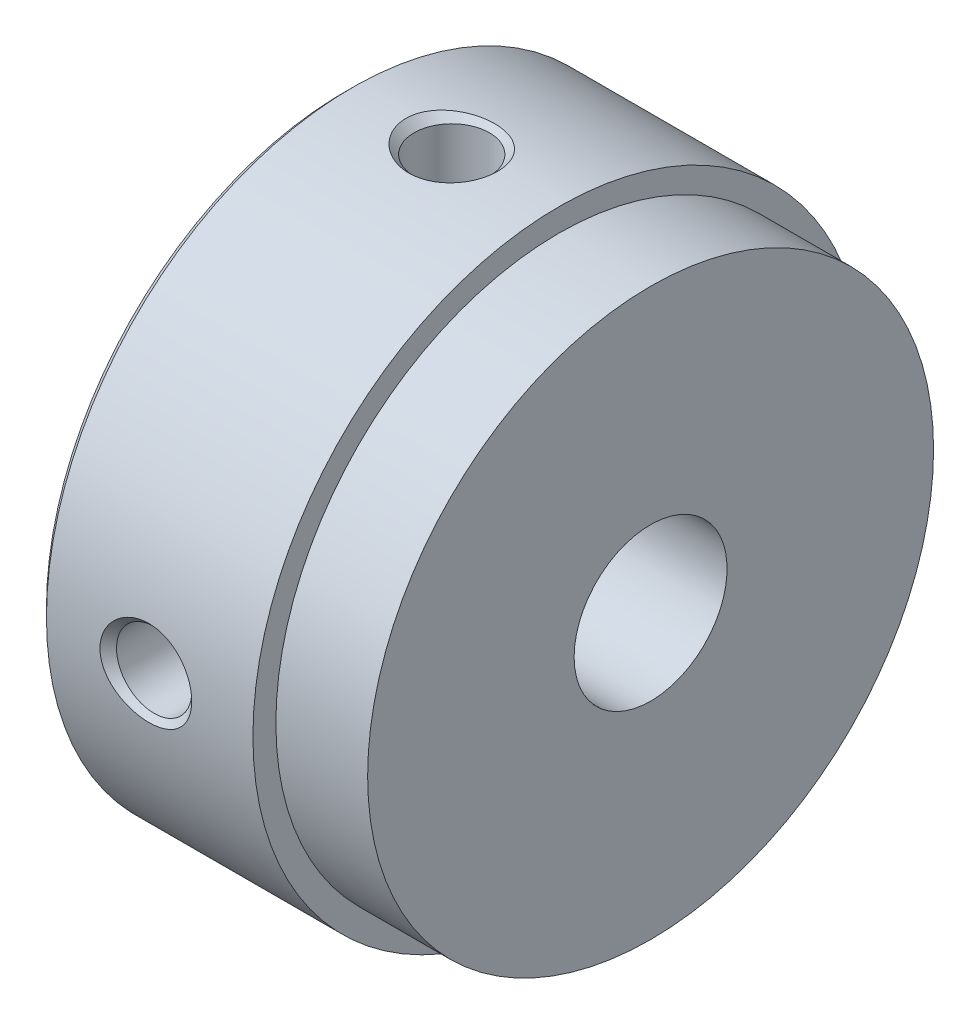
ISO-10303-21;
HEADER;
FILE_DESCRIPTION(('STEP AP214'),'2;1');
FILE_NAME('part.step','',(''),(''),'','','');
FILE_SCHEMA(('AUTOMOTIVE_DESIGN { 1 0 10303 214 1 1 1 1 }'));
ENDSEC;
DATA;
#1=APPLICATION_CONTEXT('core data for automotive mechanical design processes');
#2=APPLICATION_PROTOCOL_DEFINITION('international standard','automotive_design',2000,#1);
#3=PRODUCT_CONTEXT('',#1,'mechanical');
#4=PRODUCT('Part','Part','',(#3));
#5=PRODUCT_RELATED_PRODUCT_CATEGORY('part','',(#4));
#6=PRODUCT_DEFINITION_FORMATION('','',#4);
#7=PRODUCT_DEFINITION_CONTEXT('part definition',#1,'design');
#8=PRODUCT_DEFINITION('design','',#6,#7);
#9=PRODUCT_DEFINITION_SHAPE('','',#8);
#10=(LENGTH_UNIT() NAMED_UNIT(*) SI_UNIT(.MILLI.,.METRE.));
#11=(NAMED_UNIT(*) PLANE_ANGLE_UNIT() SI_UNIT($,.RADIAN.));
#12=(NAMED_UNIT(*) SI_UNIT($,.STERADIAN.) SOLID_ANGLE_UNIT());
#13=UNCERTAINTY_MEASURE_WITH_UNIT(LENGTH_MEASURE(1.E-05),#10,'distance_accuracy_value','');
#14=(GEOMETRIC_REPRESENTATION_CONTEXT(3) GLOBAL_UNCERTAINTY_ASSIGNED_CONTEXT((#13)) GLOBAL_UNIT_ASSIGNED_CONTEXT((#10,
#11,#12)) REPRESENTATION_CONTEXT('',''));
#15=CARTESIAN_POINT('',(0.,0.,0.));
#16=DIRECTION('',(0.,0.,1.));
#17=DIRECTION('',(1.,0.,0.));
#18=AXIS2_PLACEMENT_3D('',#15,#16,#17);
#19=CARTESIAN_POINT('',(10.,0.,0.));
#20=DIRECTION('',(-1.,0.,0.));
#21=DIRECTION('',(0.,0.,1.));
#22=AXIS2_PLACEMENT_3D('',#19,#20,#21);
#23=CYLINDRICAL_SURFACE('',#22,2.5);
#24=CARTESIAN_POINT('',(3.5,2.17677048629386,1.2295));
#25=CARTESIAN_POINT('',(3.43577157965054,2.17677578477281,1.22949567603831));
#26=CARTESIAN_POINT('',(3.37145840161485,2.17965613127623,1.22443373564332));
#27=CARTESIAN_POINT('',(3.24479296186269,2.19076511977838,1.20443802978489));
#28=CARTESIAN_POINT('',(3.18244526348724,2.19900536665854,1.1894828429574));
#29=CARTESIAN_POINT('',(3.06178049434796,2.21964982106772,1.15049288244603));
#30=CARTESIAN_POINT('',(3.00344436421692,2.23203242174292,1.12650514337545));
#31=CARTESIAN_POINT('',(2.89163886446666,2.25953301614397,1.07027430140568));
#32=CARTESIAN_POINT('',(2.83816961993367,2.27465108014549,1.03803098640703));
#33=CARTESIAN_POINT('',(2.73290921309165,2.3073920945376,0.96319105589198));
#34=CARTESIAN_POINT('',(2.68159095423238,2.32511864855142,0.919974340812396));
#35=CARTESIAN_POINT('',(2.58656498240778,2.36024183474851,0.825705223797949));
#36=CARTESIAN_POINT('',(2.54286096186909,2.37763830323748,0.774649042667674));
#37=CARTESIAN_POINT('',(2.46153942300686,2.41148805301282,0.662111759830687));
#38=CARTESIAN_POINT('',(2.42449857287542,2.42780750797796,0.600169916725053));
#39=CARTESIAN_POINT('',(2.36157797349174,2.45632763167845,0.46998145208829));
#40=CARTESIAN_POINT('',(2.33569140498105,2.46853081593453,0.401738713738438));
#41=CARTESIAN_POINT('',(2.29767038465962,2.48669812919369,0.265891555059109));
#42=CARTESIAN_POINT('',(2.28470809767051,2.49303563135054,0.198569883084163));
#43=CARTESIAN_POINT('',(2.2701826485084,2.50014754841693,0.062431543623865));
#44=CARTESIAN_POINT('',(2.26861284478198,2.50092520458377,-0.00638422935997371));
#45=CARTESIAN_POINT('',(2.27658529460569,2.4970114095747,-0.137355324561393));
#46=CARTESIAN_POINT('',(2.28520306373557,2.49277493337475,-0.199583587425359));
#47=CARTESIAN_POINT('',(2.31165896649324,2.47999000195402,-0.32157751857906));
#48=CARTESIAN_POINT('',(2.32949778835595,2.47144122487569,-0.381343002693965));
#49=CARTESIAN_POINT('',(2.37401940944104,2.45066728865061,-0.497775066556948));
#50=CARTESIAN_POINT('',(2.4008239398625,2.43839175419107,-0.554385738103421));
#51=CARTESIAN_POINT('',(2.46235522020839,2.41128063708328,-0.662445269391631));
#52=CARTESIAN_POINT('',(2.4970848338226,2.39644412951319,-0.713892253561072));
#53=CARTESIAN_POINT('',(2.57716491658394,2.36399939359176,-0.815224939173351));
#54=CARTESIAN_POINT('',(2.62319951481388,2.34626173437661,-0.864529040870136));
#55=CARTESIAN_POINT('',(2.7227439931001,2.3109071357489,-0.955025334965638));
#56=CARTESIAN_POINT('',(2.77625925277105,2.29329029286998,-0.996211637731079));
#57=CARTESIAN_POINT('',(2.89318262553734,2.25903811194194,-1.07171295926343));
#58=CARTESIAN_POINT('',(2.9569913931846,2.2425248517817,-1.10546831979465));
#59=CARTESIAN_POINT('',(3.09038839394562,2.21402136988789,-1.16151111416587));
#60=CARTESIAN_POINT('',(3.15997067798962,2.20202656123413,-1.1838101863077));
#61=CARTESIAN_POINT('',(3.29719196264242,2.18522310291627,-1.21453126486853));
#62=CARTESIAN_POINT('',(3.3645561040228,2.17992506876643,-1.22390361582539));
#63=CARTESIAN_POINT('',(3.50008742973265,2.17571958580807,-1.23136818919575));
#64=CARTESIAN_POINT('',(3.56825405861162,2.17680794945379,-1.22946780310708));
#65=CARTESIAN_POINT('',(3.6958961500224,2.18473415235663,-1.21531307007751));
#66=CARTESIAN_POINT('',(3.75553746114942,2.19096146722198,-1.20415754159092));
#67=CARTESIAN_POINT('',(3.8719956843156,2.20757429471399,-1.17342172153825));
#68=CARTESIAN_POINT('',(3.92881171175825,2.21796110057637,-1.15383880965598));
#69=CARTESIAN_POINT('',(4.04100028888366,2.24229086091557,-1.10584115883859));
#70=CARTESIAN_POINT('',(4.09618336454172,2.25637652545819,-1.07705860264962));
#71=CARTESIAN_POINT('',(4.20125178639368,2.28638221414764,-1.01180305697916));
#72=CARTESIAN_POINT('',(4.25113440655533,2.302303173498,-0.975326138787441));
#73=CARTESIAN_POINT('',(4.35050540629355,2.33650488623315,-0.890547969281477));
#74=CARTESIAN_POINT('',(4.39921394934577,2.35483785989399,-0.841349600017137));
#75=CARTESIAN_POINT('',(4.48791770975632,2.39011576473906,-0.735170333697024));
#76=CARTESIAN_POINT('',(4.52791028289974,2.40706027372645,-0.678187083402165));
#77=CARTESIAN_POINT('',(4.5988105256981,2.43817034984067,-0.556212373445873));
#78=CARTESIAN_POINT('',(4.62948583191873,2.45226230312163,-0.491065760619433));
#79=CARTESIAN_POINT('',(4.67914182473642,2.47552428578934,-0.355645146989717));
#80=CARTESIAN_POINT('',(4.69813244821317,2.48469849646164,-0.285375559910457));
#81=CARTESIAN_POINT('',(4.72229311354851,2.49644369158283,-0.148517610673093));
#82=CARTESIAN_POINT('',(4.72855118181735,2.49953370230837,-0.0821653994041285));
#83=CARTESIAN_POINT('',(4.73024751400786,2.50036729947071,0.0507015142390307));
#84=CARTESIAN_POINT('',(4.72568931889951,2.49811263561851,0.117216156315824));
#85=CARTESIAN_POINT('',(4.70661557835031,2.48881280949547,0.24415665625837));
#86=CARTESIAN_POINT('',(4.69273920156548,2.48207539270445,0.304703445078503));
#87=CARTESIAN_POINT('',(4.65626667938988,2.4647566874324,0.422518922449894));
#88=CARTESIAN_POINT('',(4.63366924376144,2.45417483019894,0.479787124510088));
#89=CARTESIAN_POINT('',(4.57935823963063,2.42955413606576,0.592219221508784));
#90=CARTESIAN_POINT('',(4.54728997682307,2.41538462396106,0.64718231755628));
#91=CARTESIAN_POINT('',(4.47539777480865,2.38509292957185,0.751179317764917));
#92=CARTESIAN_POINT('',(4.43557026410778,2.36896984937902,0.800210474610425));
#93=CARTESIAN_POINT('',(4.34482120586829,2.3345498637693,0.895939325934751));
#94=CARTESIAN_POINT('',(4.29319956782694,2.31619343676598,0.941953864582264));
#95=CARTESIAN_POINT('',(4.18265676989454,2.28070453217253,1.02490379971784));
#96=CARTESIAN_POINT('',(4.1237295674233,2.26357308650405,1.06183160401926));
#97=CARTESIAN_POINT('',(3.99811540019695,2.23218633257751,1.12635219651385));
#98=CARTESIAN_POINT('',(3.93126314651844,2.21802012200815,1.15366913997149));
#99=CARTESIAN_POINT('',(3.79303089853435,2.1953595965793,1.1962413576225));
#100=CARTESIAN_POINT('',(3.72166695611406,2.18684629005014,1.21153705090943));
#101=CARTESIAN_POINT('',(3.62464277706254,2.18019396355339,1.2234218188025));
#102=CARTESIAN_POINT('',(3.59979101049453,2.17891433517125,1.22569784953065));
#103=CARTESIAN_POINT('',(3.54996377755157,2.17720153873151,1.2287378296906));
#104=CARTESIAN_POINT('',(3.52498830335473,2.17676842490112,1.22950168225321));
#105=CARTESIAN_POINT('',(3.5,2.17677048629386,1.2295));
#106=B_SPLINE_CURVE_WITH_KNOTS('',3,(#24,#25,#26,#27,#28,#29,#30,#31,#32,#33,#34,#35,#36,#37,
#38,#39,#40,#41,#42,#43,#44,#45,#46,#47,#48,#49,#50,#51,#52,#53,#54,#55,#56,#57,#58,#59,#60,#61,
#62,#63,#64,#65,#66,#67,#68,#69,#70,#71,#72,#73,#74,#75,#76,#77,#78,#79,#80,#81,#82,#83,#84,#85,
#86,#87,#88,#89,#90,#91,#92,#93,#94,#95,#96,#97,#98,#99,#100,#101,#102,#103,#104,#105),
.UNSPECIFIED.,.T.,.F.,(4,2,2,2,2,2,2,2,2,2,2,2,2,2,2,2,2,2,2,2,2,2,2,2,2,2,2,2,2,2,2,2,2,2,2,2,
2,2,2,2,4),(0.,0.192580175732902,0.385578706777902,0.577585843527017,0.769597913753682,
0.97690428705383,1.18431091276645,1.40513537879893,1.6258246498356,1.83123896452729,
2.03653351781269,2.22454267582913,2.41256586837708,2.60325321150315,2.79400956797831,
3.00235895872482,3.21085895935151,3.43185325712993,3.65262260338025,3.85609543140499,
4.0594348576977,4.24159951831491,4.4238208601409,4.61450199283324,4.80528072324143,
5.01917124170217,5.23312655933436,5.45204697150888,5.67078095128508,5.86987095279382,
6.06889578628379,6.25549992963017,6.44213169072983,6.63690550028795,6.83176917474926,
7.04546008301269,7.25932893353865,7.47891327110501,7.6977561026392,7.77267532975101,
7.84759935598639),.UNSPECIFIED.);
#107=CARTESIAN_POINT('',(3.5,2.17677048629386,1.2295));
#108=VERTEX_POINT('',#107);
#109=EDGE_CURVE('E54',#108,#108,#106,.T.);
#110=ORIENTED_EDGE('',*,*,#109,.F.);
#111=EDGE_LOOP('',(#110));
#112=FACE_BOUND('',#111,.T.);
#113=CARTESIAN_POINT('',(10.,0.,0.));
#114=DIRECTION('',(-1.,0.,0.));
#115=DIRECTION('',(0.,0.,1.));
#116=AXIS2_PLACEMENT_3D('',#113,#114,#115);
#117=CIRCLE('',#116,2.5);
#118=CARTESIAN_POINT('',(10.,0.,2.5));
#119=VERTEX_POINT('',#118);
#120=EDGE_CURVE('E85',#119,#119,#117,.T.);
#121=ORIENTED_EDGE('',*,*,#120,.F.);
#122=EDGE_LOOP('',(#121));
#123=FACE_BOUND('',#122,.T.);
#124=CARTESIAN_POINT('',(0.,0.,0.));
#125=DIRECTION('',(-1.,0.,0.));
#126=DIRECTION('',(0.,0.,1.));
#127=AXIS2_PLACEMENT_3D('',#124,#125,#126);
#128=CIRCLE('',#127,2.5);
#129=CARTESIAN_POINT('',(0.,0.,2.5));
#130=VERTEX_POINT('',#129);
#131=EDGE_CURVE('E82',#130,#130,#128,.T.);
#132=ORIENTED_EDGE('',*,*,#131,.T.);
#133=EDGE_LOOP('',(#132));
#134=FACE_BOUND('',#133,.T.);
#135=CARTESIAN_POINT('',(4.7295,0.,2.5));
#136=CARTESIAN_POINT('',(4.72949603187039,-0.0647636833712208,2.49999658207312));
#137=CARTESIAN_POINT('',(4.72435277737242,-0.129608343857132,2.4974562169426));
#138=CARTESIAN_POINT('',(4.70400345815839,-0.257389133636325,2.4875445875616));
#139=CARTESIAN_POINT('',(4.68877746472509,-0.320321224534262,2.480163756321));
#140=CARTESIAN_POINT('',(4.64899793940587,-0.442231870711784,2.46134540862177));
#141=CARTESIAN_POINT('',(4.62448025447225,-0.501224607803293,2.44992349360497));
#142=CARTESIAN_POINT('',(4.56699482434259,-0.614175758927704,2.42407712407513));
#143=CARTESIAN_POINT('',(4.53402792715237,-0.668134677439307,2.40965297090923));
#144=CARTESIAN_POINT('',(4.45836072778912,-0.773073934844122,2.37813646129837));
#145=CARTESIAN_POINT('',(4.41520039478979,-0.823689877699854,2.36093680580909));
#146=CARTESIAN_POINT('',(4.32135946608241,-0.917298593169716,2.32616882044197));
#147=CARTESIAN_POINT('',(4.27067338928058,-0.960285759133896,2.30860022993867));
#148=CARTESIAN_POINT('',(4.1586919295908,-1.04061901097977,2.27358157758193));
#149=CARTESIAN_POINT('',(4.09688780204427,-1.07730753751897,2.25623756310688));
#150=CARTESIAN_POINT('',(3.96703856698149,-1.13961413308907,2.2254204220195));
#151=CARTESIAN_POINT('',(3.89899784818211,-1.16523991560704,2.21194460051743));
#152=CARTESIAN_POINT('',(3.76271192748435,-1.20305906421733,2.19159498373794));
#153=CARTESIAN_POINT('',(3.69471550443621,-1.21595556833272,2.18437866068211));
#154=CARTESIAN_POINT('',(3.55717252144128,-1.23010932063801,2.17644311330003));
#155=CARTESIAN_POINT('',(3.48762746619314,-1.23137741169964,2.17571783643639));
#156=CARTESIAN_POINT('',(3.35753517987713,-1.22275526426916,2.18056907697431));
#157=CARTESIAN_POINT('',(3.29687121553702,-1.21412879042285,2.18543198877257));
#158=CARTESIAN_POINT('',(3.17799658293549,-1.18814454369174,2.19966582501935));
#159=CARTESIAN_POINT('',(3.11978666047776,-1.17078413693011,2.2090381093142));
#160=CARTESIAN_POINT('',(3.00581610209196,-1.12750056916178,2.23144469225344));
#161=CARTESIAN_POINT('',(2.95014425585387,-1.10138714098109,2.24455930249789));
#162=CARTESIAN_POINT('',(2.84370943962882,-1.0414829193328,2.27297408460156));
#163=CARTESIAN_POINT('',(2.79294868180232,-1.00768868885233,2.28827523375383));
#164=CARTESIAN_POINT('',(2.6912494179781,-0.928565514752044,2.32159930545813));
#165=CARTESIAN_POINT('',(2.64104649743907,-0.882331859602548,2.33972639700315));
#166=CARTESIAN_POINT('',(2.54880628745666,-0.782014276592369,2.37513860012382));
#167=CARTESIAN_POINT('',(2.50677266042554,-0.727926846668179,2.39242333146745));
#168=CARTESIAN_POINT('',(2.43035123216446,-0.610442207437641,2.42512527090917));
#169=CARTESIAN_POINT('',(2.39637639476599,-0.546742031024941,2.44042828644209));
#170=CARTESIAN_POINT('',(2.3398986515071,-0.413586219748224,2.46648211348183));
#171=CARTESIAN_POINT('',(2.31738691713653,-0.344135062180641,2.47723642716678));
#172=CARTESIAN_POINT('',(2.28627541981136,-0.207482175212804,2.49224560157084));
#173=CARTESIAN_POINT('',(2.27669654477147,-0.140553860220579,2.49695633199743));
#174=CARTESIAN_POINT('',(2.26866762009355,-0.00588357252022877,2.50089881647761));
#175=CARTESIAN_POINT('',(2.27021255058848,0.0618580194015698,2.5001330419281));
#176=CARTESIAN_POINT('',(2.28380479154928,0.190875285752288,2.49347781447482));
#177=CARTESIAN_POINT('',(2.29506177864625,0.252256917390151,2.4879739946304));
#178=CARTESIAN_POINT('',(2.32653399427042,0.372142260170015,2.47288537323486));
#179=CARTESIAN_POINT('',(2.34675022509037,0.43064564850202,2.46330011508786));
#180=CARTESIAN_POINT('',(2.39612135977761,0.545087748749939,2.44057053305261));
#181=CARTESIAN_POINT('',(2.42552035132528,0.60090144634679,2.42733033521226));
#182=CARTESIAN_POINT('',(2.49215030489769,0.70699209196955,2.39858040750409));
#183=CARTESIAN_POINT('',(2.52938464615396,0.757266636768527,2.38306969929134));
#184=CARTESIAN_POINT('',(2.61474702044672,0.855950394229441,2.3495356461416));
#185=CARTESIAN_POINT('',(2.6635766212127,0.90372049778804,2.33141390280801));
#186=CARTESIAN_POINT('',(2.76862866585851,0.990666142300591,2.29582061390858));
#187=CARTESIAN_POINT('',(2.82485577771225,1.02983621446433,2.27834948790175));
#188=CARTESIAN_POINT('',(2.94626993232085,1.10008347153956,2.24530448109281));
#189=CARTESIAN_POINT('',(3.01174319548736,1.13072631362942,2.22984862447142));
#190=CARTESIAN_POINT('',(3.14792519079201,1.18023102354872,2.20405215859972));
#191=CARTESIAN_POINT('',(3.21862727467823,1.19910757321479,2.19370517792266));
#192=CARTESIAN_POINT('',(3.35607459143964,1.22284423562783,2.18055487114542));
#193=CARTESIAN_POINT('',(3.42255895274951,1.22886410108423,2.17712905369796));
#194=CARTESIAN_POINT('',(3.55564336837864,1.23003928557164,2.17646648712823));
#195=CARTESIAN_POINT('',(3.62224336765845,1.22519882833838,2.1792273319235));
#196=CARTESIAN_POINT('',(3.74740381223618,1.20586587242158,2.18997479914201));
#197=CARTESIAN_POINT('',(3.80615071913222,1.19227490767087,2.1974721959865));
#198=CARTESIAN_POINT('',(3.92047572080313,1.15691538222124,2.21629093548129));
#199=CARTESIAN_POINT('',(3.97605281397363,1.13514425304547,2.2276134790706));
#200=CARTESIAN_POINT('',(4.0865897937528,1.08239667891937,2.25373848300762));
#201=CARTESIAN_POINT('',(4.1412568079154,1.05089962658471,2.2687237643353));
#202=CARTESIAN_POINT('',(4.24488254616971,0.980183506835305,2.30016026838696));
#203=CARTESIAN_POINT('',(4.29383833909271,0.940960501751723,2.31661223628339));
#204=CARTESIAN_POINT('',(4.39055781573973,0.850559240008486,2.35141566438837));
#205=CARTESIAN_POINT('',(4.43752311639407,0.798521652503527,2.36976588178285));
#206=CARTESIAN_POINT('',(4.52222009542335,0.686768737221503,2.40453118293945));
#207=CARTESIAN_POINT('',(4.55994697855034,0.627049446642063,2.4209452594565));
#208=CARTESIAN_POINT('',(4.62501067738729,0.50106451322698,2.45012843535767));
#209=CARTESIAN_POINT('',(4.65230957909198,0.434776065540331,2.46288419274826));
#210=CARTESIAN_POINT('',(4.69502432618686,0.297825247199865,2.48315417216204));
#211=CARTESIAN_POINT('',(4.71047436981232,0.227176104998331,2.49068347279795));
#212=CARTESIAN_POINT('',(4.72290052895504,0.129864453339929,2.49676008502846));
#213=CARTESIAN_POINT('',(4.72537205515824,0.103972833553971,2.49797208686553));
#214=CARTESIAN_POINT('',(4.7286726104279,0.0520585071962429,2.49959274219882));
#215=CARTESIAN_POINT('',(4.7295015952369,0.026035797111249,2.50000137404863));
#216=CARTESIAN_POINT('',(4.7295,0.,2.5));
#217=B_SPLINE_CURVE_WITH_KNOTS('',3,(#135,#136,#137,#138,#139,#140,#141,#142,#143,#144,#145,
#146,#147,#148,#149,#150,#151,#152,#153,#154,#155,#156,#157,#158,#159,#160,#161,#162,#163,#164,
#165,#166,#167,#168,#169,#170,#171,#172,#173,#174,#175,#176,#177,#178,#179,#180,#181,#182,#183,
#184,#185,#186,#187,#188,#189,#190,#191,#192,#193,#194,#195,#196,#197,#198,#199,#200,#201,#202,
#203,#204,#205,#206,#207,#208,#209,#210,#211,#212,#213,#214,#215,#216),.UNSPECIFIED.,.T.,.F.,(4,
2,2,2,2,2,2,2,2,2,2,2,2,2,2,2,2,2,2,2,2,2,2,2,2,2,2,2,2,2,2,2,2,2,2,2,2,2,2,2,4),(0.,
0.194185230212835,0.388755421246395,0.582582486592844,0.776390106084326,0.981649554544243,
1.18705923606976,1.40774992259664,1.62828648325746,1.83581501401154,2.04315001583796,
2.22669248677917,2.41029034150982,2.59817028367634,2.78613446464778,2.99705716767379,
3.20807421336801,3.42828603454291,3.64832799821964,3.85054780847288,4.05267636821687,
4.23975913225936,4.42686283099875,4.61943756985849,4.81209553324303,5.02319351166663,
5.23442534172156,5.4549956839372,5.67529024730005,5.87468740201095,6.07400702174259,
6.25550832500642,6.43706666526517,6.63083512759275,6.82470260418549,7.04107954230419,
7.25756855504453,7.47483735102818,7.69147667983704,7.7695394269358,7.84760427736816),.UNSPECIFIED.);
#218=CARTESIAN_POINT('',(4.7295,0.,2.5));
#219=VERTEX_POINT('',#218);
#220=EDGE_CURVE('E35',#219,#219,#217,.T.);
#221=ORIENTED_EDGE('',*,*,#220,.F.);
#222=EDGE_LOOP('',(#221));
#223=FACE_BOUND('',#222,.T.);
#224=ADVANCED_FACE('F31',(#112,#123,#134,#223),#23,.F.);
#225=CARTESIAN_POINT('',(10.,0.,0.));
#226=DIRECTION('',(-1.,0.,0.));
#227=DIRECTION('',(0.,0.,1.));
#228=AXIS2_PLACEMENT_3D('',#225,#226,#227);
#229=CYLINDRICAL_SURFACE('',#228,10.);
#230=CARTESIAN_POINT('',(2.47309598092249,9.94778605897726,-1.02056484066684));
#231=CARTESIAN_POINT('',(2.41933274174871,9.95263062959757,-0.973340626952615));
#232=CARTESIAN_POINT('',(2.36902661424539,9.95753953131423,-0.922181406902327));
#233=CARTESIAN_POINT('',(2.27662565081912,9.96706009525681,-0.812848771445586));
#234=CARTESIAN_POINT('',(2.2345336949472,9.97167165284989,-0.754672907391523));
#235=CARTESIAN_POINT('',(2.15522967404471,9.98069301364553,-0.624891570634612));
#236=CARTESIAN_POINT('',(2.1192566970551,9.98500805278512,-0.552514518495112));
#237=CARTESIAN_POINT('',(2.06085125917876,9.99218217713245,-0.402404602268415));
#238=CARTESIAN_POINT('',(2.03841734088679,9.99504141904358,-0.324672315646763));
#239=CARTESIAN_POINT('',(2.009120370477,9.99880546918665,-0.171424157119612));
#240=CARTESIAN_POINT('',(2.001355837066,9.99982325385633,-0.0960829045607153));
#241=CARTESIAN_POINT('',(1.99897088227158,10.000134132845,0.0547969127958121));
#242=CARTESIAN_POINT('',(2.00434653086858,9.99942774283726,0.130335411849986));
#243=CARTESIAN_POINT('',(2.02758668161371,9.99642846551868,0.276776806105327));
#244=CARTESIAN_POINT('',(2.04502016837426,9.99419035860618,0.347749982297542));
#245=CARTESIAN_POINT('',(2.09121522673089,9.98843015489408,0.485843093178218));
#246=CARTESIAN_POINT('',(2.11997771935117,9.98490795370207,0.552962714072336));
#247=CARTESIAN_POINT('',(2.18857725546589,9.97685185794294,0.68322002111652));
#248=CARTESIAN_POINT('',(2.22865759072913,9.97229622737974,0.746227853768972));
#249=CARTESIAN_POINT('',(2.31823056204534,9.96268863790012,0.865100302179756));
#250=CARTESIAN_POINT('',(2.36772558374495,9.95763655334128,0.920963101399767));
#251=CARTESIAN_POINT('',(2.47800834910569,9.94720566914986,1.02769470585994));
#252=CARTESIAN_POINT('',(2.53930814633682,9.94182616060481,1.07803411344928));
#253=CARTESIAN_POINT('',(2.66908660529599,9.93160448647937,1.16846412161937));
#254=CARTESIAN_POINT('',(2.73756740533769,9.92676248184212,1.20855165717286));
#255=CARTESIAN_POINT('',(2.88456810471373,9.91780649351088,1.28003995542236));
#256=CARTESIAN_POINT('',(2.96345152637075,9.91376066834328,1.31070282139145));
#257=CARTESIAN_POINT('',(3.12516640354918,9.90725115216845,1.35903319840312));
#258=CARTESIAN_POINT('',(3.20799872977308,9.90478781183612,1.3766978291936));
#259=CARTESIAN_POINT('',(3.37890494961808,9.9016403905718,1.39916284519963));
#260=CARTESIAN_POINT('',(3.46705425831568,9.90103371446979,1.40340383143447));
#261=CARTESIAN_POINT('',(3.64285047271134,9.90188801080786,1.39736234029168));
#262=CARTESIAN_POINT('',(3.73049731614676,9.90334923415803,1.38707810048535));
#263=CARTESIAN_POINT('',(3.9038597532638,9.90820255712822,1.35197568328223));
#264=CARTESIAN_POINT('',(3.98954060465311,9.91161711873527,1.32698833336983));
#265=CARTESIAN_POINT('',(4.15536040711243,9.91999349782495,1.26284184582618));
#266=CARTESIAN_POINT('',(4.23549926181121,9.92495534220541,1.22368246182751));
#267=CARTESIAN_POINT('',(4.38645384802164,9.93573853306013,1.13276392847506));
#268=CARTESIAN_POINT('',(4.45739996697199,9.94154459504111,1.08121996568244));
#269=CARTESIAN_POINT('',(4.58903213293499,9.95336401245668,0.966366786758813));
#270=CARTESIAN_POINT('',(4.64972084035577,9.95937731365215,0.903060630292882));
#271=CARTESIAN_POINT('',(4.75574670294296,9.97054543330341,0.769719002046592));
#272=CARTESIAN_POINT('',(4.80169676775728,9.97572806059188,0.700174131295822));
#273=CARTESIAN_POINT('',(4.88025527609634,9.98491910225308,0.553845352816649));
#274=CARTESIAN_POINT('',(4.91287096534173,9.98892815399376,0.477065404517991));
#275=CARTESIAN_POINT('',(4.96142833074595,9.99500831512589,0.324380237309349));
#276=CARTESIAN_POINT('',(4.97839616312124,9.99719757209399,0.248805586083639));
#277=CARTESIAN_POINT('',(4.99875360733173,9.9998329306013,0.0958262205922462));
#278=CARTESIAN_POINT('',(5.00214809443108,10.0002796580196,0.0184221734579494));
#279=CARTESIAN_POINT('',(4.99538862806923,9.9993991606975,-0.131830773252802));
#280=CARTESIAN_POINT('',(4.98591227648304,9.99816065127932,-0.204711796646791));
#281=CARTESIAN_POINT('',(4.95499586976722,9.99420509136334,-0.347838665390217));
#282=CARTESIAN_POINT('',(4.93355601102558,9.9914880651363,-0.418084553976739));
#283=CARTESIAN_POINT('',(4.87943045108851,9.98485483820541,-0.554399053857458));
#284=CARTESIAN_POINT('',(4.84669308128533,9.9809331371962,-0.620446792297833));
#285=CARTESIAN_POINT('',(4.77116592021425,9.97230190263064,-0.746451685964572));
#286=CARTESIAN_POINT('',(4.72837404373032,9.96759220570929,-0.806407574095214));
#287=CARTESIAN_POINT('',(4.63157002993824,9.95758460968094,-0.921984288456229));
#288=CARTESIAN_POINT('',(4.57708180288082,9.95226874409907,-0.977204344572804));
#289=CARTESIAN_POINT('',(4.46010854860542,9.94181183598034,-1.07841183514694));
#290=CARTESIAN_POINT('',(4.39762110348151,9.93667084690019,-1.12439646719241));
#291=CARTESIAN_POINT('',(4.26184306181222,9.92673099287162,-1.20911507008739));
#292=CARTESIAN_POINT('',(4.18810621633623,9.92197942690465,-1.24713995860748));
#293=CARTESIAN_POINT('',(4.03547281470895,9.91374167164144,-1.31101728935736));
#294=CARTESIAN_POINT('',(3.95657504800434,9.91025578048892,-1.33686686398295));
#295=CARTESIAN_POINT('',(3.79156849385979,9.90477190699714,-1.37692741055618));
#296=CARTESIAN_POINT('',(3.70529692466914,9.90285834789982,-1.39048165934861));
#297=CARTESIAN_POINT('',(3.53166223912944,9.90103809639314,-1.40338405437722));
#298=CARTESIAN_POINT('',(3.44429884215032,9.90113193100181,-1.40272846998529));
#299=CARTESIAN_POINT('',(3.26901103637584,9.90334036608968,-1.38705236189585));
#300=CARTESIAN_POINT('',(3.1811143752986,9.90549800544836,-1.37172588419308));
#301=CARTESIAN_POINT('',(3.00921612620174,9.9116474983803,-1.32655951548342));
#302=CARTESIAN_POINT('',(2.92521279854378,9.91563852388053,-1.29672617633627));
#303=CARTESIAN_POINT('',(2.77710447986604,9.92419850731334,-1.22931992280683));
#304=CARTESIAN_POINT('',(2.71201581773421,9.92856044808351,-1.1938640963586));
#305=CARTESIAN_POINT('',(2.58775801788376,9.93785431221512,-1.11385438167189));
#306=CARTESIAN_POINT('',(2.52858564752031,9.94278592110124,-1.06930550277383));
#307=CARTESIAN_POINT('',(2.47309598092249,9.94778605897726,-1.02056484066684));
#308=B_SPLINE_CURVE_WITH_KNOTS('',3,(#230,#231,#232,#233,#234,#235,#236,#237,#238,#239,#240,
#241,#242,#243,#244,#245,#246,#247,#248,#249,#250,#251,#252,#253,#254,#255,#256,#257,#258,#259,
#260,#261,#262,#263,#264,#265,#266,#267,#268,#269,#270,#271,#272,#273,#274,#275,#276,#277,#278,
#279,#280,#281,#282,#283,#284,#285,#286,#287,#288,#289,#290,#291,#292,#293,#294,#295,#296,#297,
#298,#299,#300,#301,#302,#303,#304,#305,#306,#307),.UNSPECIFIED.,.T.,.F.,(4,2,2,2,2,2,2,2,2,2,2,
2,2,2,2,2,2,2,2,2,2,2,2,2,2,2,2,2,2,2,2,2,2,2,2,2,2,2,4),(0.,0.214966326771733,
0.430007890101768,0.671528523562845,0.913023154016267,1.13912228479122,1.3651538011845,
1.58349707886357,1.80185811105431,2.02532646765433,2.24885152592451,2.48632933131262,
2.72387805323661,2.97693381968733,3.23004564337048,3.49357519928465,3.7571367334931,
4.02379177089653,4.29045144406845,4.55277597826159,4.81503237003429,5.06425900680828,
5.31335003659822,5.54461645758207,5.77579980499822,5.99527228627884,6.21474116489584,
6.43522737564115,6.65575935370674,6.88803300147785,7.12037702460562,7.36857896378715,
7.61683933180778,7.87768998109054,8.13860911453727,8.40509088903825,8.67145242168922,
8.89344364226921,9.11531289690555),.UNSPECIFIED.);
#309=CARTESIAN_POINT('',(2.47309598092249,9.94778605897726,-1.02056484066684));
#310=VERTEX_POINT('',#309);
#311=EDGE_CURVE('E43',#310,#310,#308,.T.);
#312=ORIENTED_EDGE('',*,*,#311,.F.);
#313=EDGE_LOOP('',(#312));
#314=FACE_BOUND('',#313,.T.);
#315=CARTESIAN_POINT('',(0.25,0.,0.));
#316=DIRECTION('',(-1.,0.,0.));
#317=DIRECTION('',(0.,0.,1.));
#318=AXIS2_PLACEMENT_3D('',#315,#316,#317);
#319=CIRCLE('',#318,10.);
#320=CARTESIAN_POINT('',(0.25,0.,10.));
#321=VERTEX_POINT('',#320);
#322=EDGE_CURVE('E97',#321,#321,#319,.T.);
#323=ORIENTED_EDGE('',*,*,#322,.F.);
#324=EDGE_LOOP('',(#323));
#325=FACE_BOUND('',#324,.T.);
#326=CARTESIAN_POINT('',(7.,0.,0.));
#327=DIRECTION('',(-1.,0.,0.));
#328=DIRECTION('',(0.,0.,1.));
#329=AXIS2_PLACEMENT_3D('',#326,#327,#328);
#330=CIRCLE('',#329,10.);
#331=CARTESIAN_POINT('',(7.,0.,10.));
#332=VERTEX_POINT('',#331);
#333=EDGE_CURVE('E94',#332,#332,#330,.T.);
#334=ORIENTED_EDGE('',*,*,#333,.T.);
#335=EDGE_LOOP('',(#334));
#336=FACE_BOUND('',#335,.T.);
#337=CARTESIAN_POINT('',(2.47309598092249,-1.02056484066684,9.94778605897726));
#338=CARTESIAN_POINT('',(2.52677189981299,-1.06771089335917,9.94294942840246));
#339=CARTESIAN_POINT('',(2.58390702615604,-1.11094778487923,9.93817553298361));
#340=CARTESIAN_POINT('',(2.70377316178341,-1.18894327300194,9.92914691191021));
#341=CARTESIAN_POINT('',(2.76650920198876,-1.22369414039379,9.92489266130604));
#342=CARTESIAN_POINT('',(2.90822573249212,-1.28978618722003,9.91654003294524));
#343=CARTESIAN_POINT('',(2.98806808877336,-1.31931609277569,9.91261515062805));
#344=CARTESIAN_POINT('',(3.1515235236515,-1.36518676914151,9.90640209014056));
#345=CARTESIAN_POINT('',(3.23513807978499,-1.38152232364517,9.90411455932787));
#346=CARTESIAN_POINT('',(3.40702404318795,-1.40105103785563,9.90137169956546));
#347=CARTESIAN_POINT('',(3.49535401555038,-1.4037425937334,9.90098631354241));
#348=CARTESIAN_POINT('',(3.67124194834859,-1.39457112229023,9.90228211245317));
#349=CARTESIAN_POINT('',(3.75879985986009,-1.38270717919206,9.90396342741603));
#350=CARTESIAN_POINT('',(3.93158566294166,-1.34445590325839,9.90922868096571));
#351=CARTESIAN_POINT('',(4.01678019962788,-1.31792000797516,9.91283206831732));
#352=CARTESIAN_POINT('',(4.1813576650456,-1.25075181053787,9.92153016223691));
#353=CARTESIAN_POINT('',(4.26074047747421,-1.21011922637742,9.92662489863925));
#354=CARTESIAN_POINT('',(4.40980169710743,-1.11646880975357,9.93758888146771));
#355=CARTESIAN_POINT('',(4.47962845072467,-1.06368583877124,9.94344262163399));
#356=CARTESIAN_POINT('',(4.60879889259032,-0.946546817239136,9.95527504255324));
#357=CARTESIAN_POINT('',(4.66814553113954,-0.882194034083438,9.96125368761202));
#358=CARTESIAN_POINT('',(4.77126538344678,-0.747170462423029,9.97226544285642));
#359=CARTESIAN_POINT('',(4.81568294520043,-0.676995346107991,9.97733138142049));
#360=CARTESIAN_POINT('',(4.89108881618659,-0.529694365997958,9.98623292871275));
#361=CARTESIAN_POINT('',(4.92208445808913,-0.452572325342386,9.99006920893015));
#362=CARTESIAN_POINT('',(4.96749720575756,-0.299541966424278,9.99578469280565));
#363=CARTESIAN_POINT('',(4.98294353142297,-0.223943006114066,9.99778448351291));
#364=CARTESIAN_POINT('',(5.00031573617332,-0.0711887665172498,10.0000378290191));
#365=CARTESIAN_POINT('',(5.00224620921994,0.00596597502501025,10.0002919771516));
#366=CARTESIAN_POINT('',(4.99274441355196,0.155674676391255,9.99905514088515));
#367=CARTESIAN_POINT('',(4.98195226569821,0.228271032477153,9.99764774954664));
#368=CARTESIAN_POINT('',(4.9485071776854,0.370623474797861,9.99338337368427));
#369=CARTESIAN_POINT('',(4.92585424845514,0.440379563649697,9.9905263904961));
#370=CARTESIAN_POINT('',(4.86934799906529,0.575756296449204,9.98364363701556));
#371=CARTESIAN_POINT('',(4.83540884523839,0.641340512753832,9.97960893967128));
#372=CARTESIAN_POINT('',(4.75758098306333,0.76624588286377,9.97079708485493));
#373=CARTESIAN_POINT('',(4.71369012756347,0.825565681021116,9.96601976722721));
#374=CARTESIAN_POINT('',(4.61467000928403,0.939786002613442,9.95591646847456));
#375=CARTESIAN_POINT('',(4.55905531805369,0.994263876888742,9.95057476193367));
#376=CARTESIAN_POINT('',(4.43995549940169,1.09382042721509,9.94012416857133));
#377=CARTESIAN_POINT('',(4.3764680038295,1.13889626413134,9.93501535243873));
#378=CARTESIAN_POINT('',(4.23878720919834,1.22157305173364,9.92520098407249));
#379=CARTESIAN_POINT('',(4.16415947802128,1.25845725544318,9.92054647889027));
#380=CARTESIAN_POINT('',(4.00993009002748,1.31991261402395,9.912557383597));
#381=CARTESIAN_POINT('',(3.93032719480048,1.34448068934416,9.90922312364664));
#382=CARTESIAN_POINT('',(3.76420436658163,1.3817629297155,9.90409555697605));
#383=CARTESIAN_POINT('',(3.67753686423134,1.39383349837598,9.90238625583926));
#384=CARTESIAN_POINT('',(3.50337237536275,1.4037015784585,9.90099218067399));
#385=CARTESIAN_POINT('',(3.41587526918642,1.4014969986422,9.90130770327208));
#386=CARTESIAN_POINT('',(3.2407340445864,1.38266941758889,9.90395466364509));
#387=CARTESIAN_POINT('',(3.15312052302622,1.3657652504054,9.90632540991842));
#388=CARTESIAN_POINT('',(2.98202992422492,1.31748792667808,9.91286106158821));
#389=CARTESIAN_POINT('',(2.89855307277067,1.28611398130905,9.91702606479841));
#390=CARTESIAN_POINT('',(2.7389182453035,1.20984735519183,9.92661717935074));
#391=CARTESIAN_POINT('',(2.66270638803093,1.16506641167099,9.93203278568373));
#392=CARTESIAN_POINT('',(2.51932704442388,1.06285289716208,9.94348923411007));
#393=CARTESIAN_POINT('',(2.45215811855596,1.0054223436964,9.94952997641733));
#394=CARTESIAN_POINT('',(2.33181156579093,0.881832972269917,9.96122778236008));
#395=CARTESIAN_POINT('',(2.2781804010869,0.816117274293239,9.96689051211509));
#396=CARTESIAN_POINT('',(2.18366713749368,0.676013652616074,9.9773704498836));
#397=CARTESIAN_POINT('',(2.14277866466726,0.601630090275729,9.98218808008986));
#398=CARTESIAN_POINT('',(2.07791843803368,0.451798285099306,9.99005058902722));
#399=CARTESIAN_POINT('',(2.05297646011848,0.376775279306868,9.99319461896867));
#400=CARTESIAN_POINT('',(2.01687494790828,0.223440781734966,9.99779686958387));
#401=CARTESIAN_POINT('',(2.00570892826063,0.145130855318079,9.99925588349741));
#402=CARTESIAN_POINT('',(1.99792542919406,-0.00738737987815519,10.0002703358382));
#403=CARTESIAN_POINT('',(2.00045798716817,-0.081552813526499,9.99993699342222));
#404=CARTESIAN_POINT('',(2.01800767242676,-0.228367062059619,9.99766160418204));
#405=CARTESIAN_POINT('',(2.03302502781802,-0.301015849209245,9.99571952796508));
#406=CARTESIAN_POINT('',(2.07466886446324,-0.441909074229983,9.9904772848621));
#407=CARTESIAN_POINT('',(2.10115832950815,-0.510194901821546,9.987193171832));
#408=CARTESIAN_POINT('',(2.16471618123962,-0.641550155036953,9.97961637115688));
#409=CARTESIAN_POINT('',(2.20178034143964,-0.704621651757159,9.97532408657805));
#410=CARTESIAN_POINT('',(2.2764111742133,-0.81153860573279,9.96712846198348));
#411=CARTESIAN_POINT('',(2.31222292912137,-0.856633321286906,9.96333404169556));
#412=CARTESIAN_POINT('',(2.38897642131528,-0.942182805912472,9.95560821289304));
#413=CARTESIAN_POINT('',(2.42991693401377,-0.982638678193193,9.95167683724033));
#414=CARTESIAN_POINT('',(2.47309598092249,-1.02056484066684,9.94778605897726));
#415=B_SPLINE_CURVE_WITH_KNOTS('',3,(#337,#338,#339,#340,#341,#342,#343,#344,#345,#346,#347,
#348,#349,#350,#351,#352,#353,#354,#355,#356,#357,#358,#359,#360,#361,#362,#363,#364,#365,#366,
#367,#368,#369,#370,#371,#372,#373,#374,#375,#376,#377,#378,#379,#380,#381,#382,#383,#384,#385,
#386,#387,#388,#389,#390,#391,#392,#393,#394,#395,#396,#397,#398,#399,#400,#401,#402,#403,#404,
#405,#406,#407,#408,#409,#410,#411,#412,#413,#414),.UNSPECIFIED.,.T.,.F.,(4,2,2,2,2,2,2,2,2,2,2,
2,2,2,2,2,2,2,2,2,2,2,2,2,2,2,2,2,2,2,2,2,2,2,2,2,2,2,4),(0.,0.21465905634132,0.429512904490815,
0.683997468820186,0.938582592898337,1.20246262031695,1.46635925092564,1.7329782709335,
1.99960262500292,2.26145158187301,2.52322670663229,2.77152819336333,3.01969385622997,
3.25006841260005,3.4803646621615,3.69955151506824,3.91873816601145,4.13963141805556,
4.3605723748462,4.59366804475225,4.826834001019,5.07585565435746,5.32493954258294,
5.58629430067807,5.84768734681319,6.11419296884649,6.38071312124799,6.64507109692022,
6.90938693987636,7.16308850416264,7.41666296163241,7.65279381026765,7.88881345234477,
8.11036337957971,8.33191735478976,8.55089519688156,8.76978564037918,8.94250709670723,
9.11518739086394),.UNSPECIFIED.);
#416=CARTESIAN_POINT('',(2.47309598092249,-1.02056484066684,9.94778605897726));
#417=VERTEX_POINT('',#416);
#418=EDGE_CURVE('E10',#417,#417,#415,.T.);
#419=ORIENTED_EDGE('',*,*,#418,.F.);
#420=EDGE_LOOP('',(#419));
#421=FACE_BOUND('',#420,.T.);
#422=ADVANCED_FACE('F58',(#314,#325,#336,#421),#229,.T.);
#423=CARTESIAN_POINT('',(0.25,0.,0.));
#424=DIRECTION('',(1.,0.,0.));
#425=DIRECTION('',(0.,0.,-1.));
#426=AXIS2_PLACEMENT_3D('',#423,#424,#425);
#427=CONICAL_SURFACE('',#426,10.,0.785398163397448);
#428=CARTESIAN_POINT('',(0.,0.,0.));
#429=DIRECTION('',(-1.,0.,0.));
#430=DIRECTION('',(0.,0.,1.));
#431=AXIS2_PLACEMENT_3D('',#428,#429,#430);
#432=CIRCLE('',#431,9.75);
#433=CARTESIAN_POINT('',(0.,0.,9.75));
#434=VERTEX_POINT('',#433);
#435=EDGE_CURVE('E47',#434,#434,#432,.T.);
#436=ORIENTED_EDGE('',*,*,#435,.F.);
#437=EDGE_LOOP('',(#436));
#438=FACE_BOUND('',#437,.T.);
#439=ORIENTED_EDGE('',*,*,#322,.T.);
#440=EDGE_LOOP('',(#439));
#441=FACE_BOUND('',#440,.T.);
#442=ADVANCED_FACE('F33',(#438,#441),#427,.T.);
#443=CARTESIAN_POINT('',(0.,9.75,0.));
#444=DIRECTION('',(1.,0.,0.));
#445=DIRECTION('',(0.,0.,-1.));
#446=AXIS2_PLACEMENT_3D('',#443,#444,#445);
#447=PLANE('',#446);
#448=ORIENTED_EDGE('',*,*,#131,.F.);
#449=EDGE_LOOP('',(#448));
#450=FACE_BOUND('',#449,.T.);
#451=ORIENTED_EDGE('',*,*,#435,.T.);
#452=EDGE_LOOP('',(#451));
#453=FACE_BOUND('',#452,.T.);
#454=ADVANCED_FACE('F123',(#450,#453),#447,.F.);
#455=CARTESIAN_POINT('',(10.,2.5,0.));
#456=DIRECTION('',(-1.,0.,0.));
#457=DIRECTION('',(0.,0.,1.));
#458=AXIS2_PLACEMENT_3D('',#455,#456,#457);
#459=PLANE('',#458);
#460=CARTESIAN_POINT('',(10.,0.,0.));
#461=DIRECTION('',(-1.,0.,0.));
#462=DIRECTION('',(0.,0.,1.));
#463=AXIS2_PLACEMENT_3D('',#460,#461,#462);
#464=CIRCLE('',#463,9.25);
#465=CARTESIAN_POINT('',(10.,0.,9.25));
#466=VERTEX_POINT('',#465);
#467=EDGE_CURVE('E88',#466,#466,#464,.T.);
#468=ORIENTED_EDGE('',*,*,#467,.F.);
#469=EDGE_LOOP('',(#468));
#470=FACE_BOUND('',#469,.T.);
#471=ORIENTED_EDGE('',*,*,#120,.T.);
#472=EDGE_LOOP('',(#471));
#473=FACE_BOUND('',#472,.T.);
#474=ADVANCED_FACE('F121',(#470,#473),#459,.F.);
#475=CARTESIAN_POINT('',(10.,0.,0.));
#476=DIRECTION('',(-1.,0.,0.));
#477=DIRECTION('',(0.,0.,1.));
#478=AXIS2_PLACEMENT_3D('',#475,#476,#477);
#479=CYLINDRICAL_SURFACE('',#478,9.25);
#480=CARTESIAN_POINT('',(7.,0.,0.));
#481=DIRECTION('',(-1.,0.,0.));
#482=DIRECTION('',(0.,0.,1.));
#483=AXIS2_PLACEMENT_3D('',#480,#481,#482);
#484=CIRCLE('',#483,9.25);
#485=CARTESIAN_POINT('',(7.,0.,9.25));
#486=VERTEX_POINT('',#485);
#487=EDGE_CURVE('E91',#486,#486,#484,.T.);
#488=ORIENTED_EDGE('',*,*,#487,.F.);
#489=EDGE_LOOP('',(#488));
#490=FACE_BOUND('',#489,.T.);
#491=ORIENTED_EDGE('',*,*,#467,.T.);
#492=EDGE_LOOP('',(#491));
#493=FACE_BOUND('',#492,.T.);
#494=ADVANCED_FACE('F131',(#490,#493),#479,.T.);
#495=CARTESIAN_POINT('',(7.,9.25,0.));
#496=DIRECTION('',(-1.,0.,0.));
#497=DIRECTION('',(0.,0.,1.));
#498=AXIS2_PLACEMENT_3D('',#495,#496,#497);
#499=PLANE('',#498);
#500=ORIENTED_EDGE('',*,*,#333,.F.);
#501=EDGE_LOOP('',(#500));
#502=FACE_BOUND('',#501,.T.);
#503=ORIENTED_EDGE('',*,*,#487,.T.);
#504=EDGE_LOOP('',(#503));
#505=FACE_BOUND('',#504,.T.);
#506=ADVANCED_FACE('F72',(#502,#505),#499,.F.);
#507=CARTESIAN_POINT('',(3.5,0.,0.));
#508=DIRECTION('',(0.,1.,0.));
#509=DIRECTION('',(0.,0.,1.));
#510=AXIS2_PLACEMENT_3D('',#507,#508,#509);
#511=CYLINDRICAL_SURFACE('',#510,1.2295);
#512=CARTESIAN_POINT('',(3.5,9.7295,0.));
#513=DIRECTION('',(0.,1.,0.));
#514=DIRECTION('',(0.,0.,1.));
#515=AXIS2_PLACEMENT_3D('',#512,#513,#514);
#516=CIRCLE('',#515,1.2295);
#517=CARTESIAN_POINT('',(3.5,9.7295,1.2295));
#518=VERTEX_POINT('',#517);
#519=EDGE_CURVE('E100',#518,#518,#516,.T.);
#520=ORIENTED_EDGE('',*,*,#519,.T.);
#521=EDGE_LOOP('',(#520));
#522=FACE_BOUND('',#521,.T.);
#523=ORIENTED_EDGE('',*,*,#109,.T.);
#524=EDGE_LOOP('',(#523));
#525=FACE_BOUND('',#524,.T.);
#526=ADVANCED_FACE('F68',(#522,#525),#511,.F.);
#527=CARTESIAN_POINT('',(3.5,9.7295,0.));
#528=DIRECTION('',(0.,1.,0.));
#529=DIRECTION('',(0.,0.,1.));
#530=AXIS2_PLACEMENT_3D('',#527,#528,#529);
#531=CONICAL_SURFACE('',#530,1.2295,0.785398163397449);
#532=ORIENTED_EDGE('',*,*,#519,.F.);
#533=EDGE_LOOP('',(#532));
#534=FACE_BOUND('',#533,.T.);
#535=ORIENTED_EDGE('',*,*,#311,.T.);
#536=EDGE_LOOP('',(#535));
#537=FACE_BOUND('',#536,.T.);
#538=ADVANCED_FACE('F71',(#534,#537),#531,.F.);
#539=CARTESIAN_POINT('',(3.5,0.,0.));
#540=DIRECTION('',(0.,0.,1.));
#541=DIRECTION('',(0.,-1.,0.));
#542=AXIS2_PLACEMENT_3D('',#539,#540,#541);
#543=CYLINDRICAL_SURFACE('',#542,1.2295);
#544=CARTESIAN_POINT('',(3.5,0.,9.7295));
#545=DIRECTION('',(0.,0.,1.));
#546=DIRECTION('',(0.,-1.,0.));
#547=AXIS2_PLACEMENT_3D('',#544,#545,#546);
#548=CIRCLE('',#547,1.2295);
#549=CARTESIAN_POINT('',(3.5,-1.2295,9.7295));
#550=VERTEX_POINT('',#549);
#551=EDGE_CURVE('E103',#550,#550,#548,.T.);
#552=ORIENTED_EDGE('',*,*,#551,.T.);
#553=EDGE_LOOP('',(#552));
#554=FACE_BOUND('',#553,.T.);
#555=ORIENTED_EDGE('',*,*,#220,.T.);
#556=EDGE_LOOP('',(#555));
#557=FACE_BOUND('',#556,.T.);
#558=ADVANCED_FACE('F65',(#554,#557),#543,.F.);
#559=CARTESIAN_POINT('',(3.5,0.,9.7295));
#560=DIRECTION('',(0.,0.,1.));
#561=DIRECTION('',(0.,-1.,0.));
#562=AXIS2_PLACEMENT_3D('',#559,#560,#561);
#563=CONICAL_SURFACE('',#562,1.2295,0.785398163397449);
#564=ORIENTED_EDGE('',*,*,#551,.F.);
#565=EDGE_LOOP('',(#564));
#566=FACE_BOUND('',#565,.T.);
#567=ORIENTED_EDGE('',*,*,#418,.T.);
#568=EDGE_LOOP('',(#567));
#569=FACE_BOUND('',#568,.T.);
#570=ADVANCED_FACE('F62',(#566,#569),#563,.F.);
#571=CLOSED_SHELL('',(#224,#422,#442,#454,#474,#494,#506,#526,#538,#558,#570));
#572=MANIFOLD_SOLID_BREP('B2',#571);
#573=ADVANCED_BREP_SHAPE_REPRESENTATION('',(#18,#572),#14);
#574=SHAPE_DEFINITION_REPRESENTATION(#9,#573);
ENDSEC;
END-ISO-10303-21;
